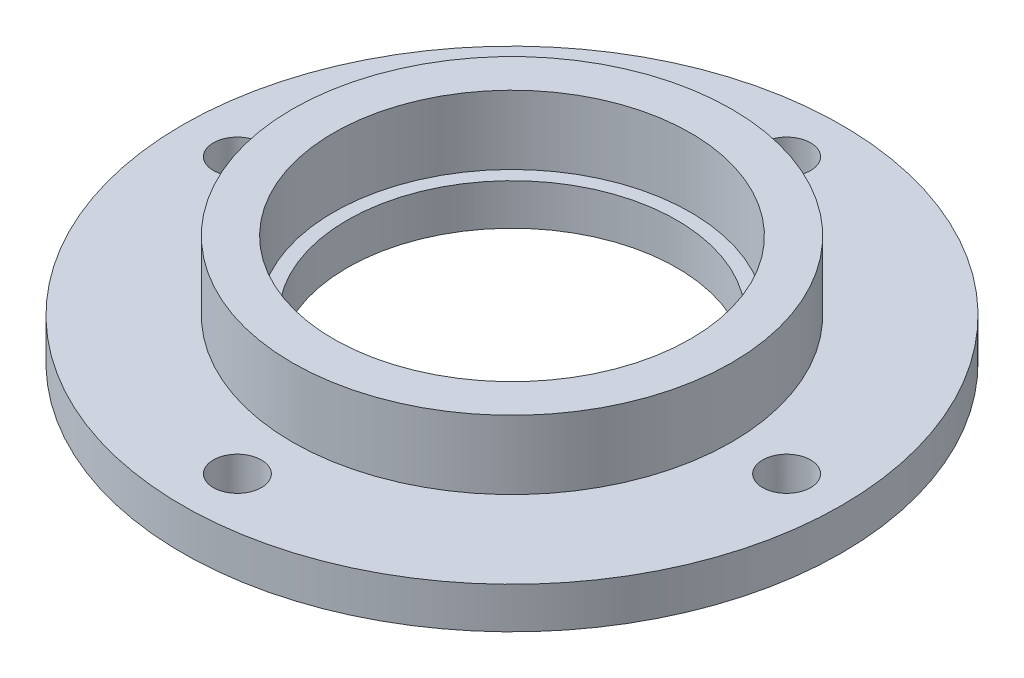
ISO-10303-21;
HEADER;
FILE_DESCRIPTION(('STEP AP214'),'2;1');
FILE_NAME('part.step','',(''),(''),'','','');
FILE_SCHEMA(('AUTOMOTIVE_DESIGN { 1 0 10303 214 1 1 1 1 }'));
ENDSEC;
DATA;
#1=APPLICATION_CONTEXT('core data for automotive mechanical design processes');
#2=APPLICATION_PROTOCOL_DEFINITION('international standard','automotive_design',2000,#1);
#3=PRODUCT_CONTEXT('',#1,'mechanical');
#4=PRODUCT('Part','Part','',(#3));
#5=PRODUCT_RELATED_PRODUCT_CATEGORY('part','',(#4));
#6=PRODUCT_DEFINITION_FORMATION('','',#4);
#7=PRODUCT_DEFINITION_CONTEXT('part definition',#1,'design');
#8=PRODUCT_DEFINITION('design','',#6,#7);
#9=PRODUCT_DEFINITION_SHAPE('','',#8);
#10=(LENGTH_UNIT() NAMED_UNIT(*) SI_UNIT(.MILLI.,.METRE.));
#11=(NAMED_UNIT(*) PLANE_ANGLE_UNIT() SI_UNIT($,.RADIAN.));
#12=(NAMED_UNIT(*) SI_UNIT($,.STERADIAN.) SOLID_ANGLE_UNIT());
#13=UNCERTAINTY_MEASURE_WITH_UNIT(LENGTH_MEASURE(1.E-05),#10,'distance_accuracy_value','');
#14=(GEOMETRIC_REPRESENTATION_CONTEXT(3) GLOBAL_UNCERTAINTY_ASSIGNED_CONTEXT((#13)) GLOBAL_UNIT_ASSIGNED_CONTEXT((#10,
#11,#12)) REPRESENTATION_CONTEXT('',''));
#15=CARTESIAN_POINT('',(0.,0.,0.));
#16=DIRECTION('',(0.,0.,1.));
#17=DIRECTION('',(1.,0.,0.));
#18=AXIS2_PLACEMENT_3D('',#15,#16,#17);
#19=CARTESIAN_POINT('',(9.30660225430559E-13,-271.309816206596,0.));
#20=DIRECTION('',(0.,-1.,0.));
#21=DIRECTION('',(1.,0.,0.));
#22=AXIS2_PLACEMENT_3D('',#19,#20,#21);
#23=CYLINDRICAL_SURFACE('',#22,12.);
#24=CARTESIAN_POINT('',(0.,3.00000000000006,0.));
#25=DIRECTION('',(0.,-1.,0.));
#26=DIRECTION('',(1.,0.,0.));
#27=AXIS2_PLACEMENT_3D('',#24,#25,#26);
#28=CIRCLE('',#27,12.);
#29=CARTESIAN_POINT('',(12.,3.0000000000001,0.));
#30=VERTEX_POINT('',#29);
#31=EDGE_CURVE('E66',#30,#30,#28,.T.);
#32=ORIENTED_EDGE('',*,*,#31,.F.);
#33=EDGE_LOOP('',(#32));
#34=FACE_BOUND('',#33,.T.);
#35=CARTESIAN_POINT('',(0.,0.,0.));
#36=DIRECTION('',(0.,-1.,0.));
#37=DIRECTION('',(1.,0.,0.));
#38=AXIS2_PLACEMENT_3D('',#35,#36,#37);
#39=CIRCLE('',#38,12.);
#40=CARTESIAN_POINT('',(12.,0.,0.));
#41=VERTEX_POINT('',#40);
#42=EDGE_CURVE('E10',#41,#41,#39,.T.);
#43=ORIENTED_EDGE('',*,*,#42,.T.);
#44=EDGE_LOOP('',(#43));
#45=FACE_BOUND('',#44,.T.);
#46=ADVANCED_FACE('F39',(#34,#45),#23,.F.);
#47=CARTESIAN_POINT('',(-12.,0.,0.));
#48=DIRECTION('',(0.,1.,0.));
#49=DIRECTION('',(-1.,0.,0.));
#50=AXIS2_PLACEMENT_3D('',#47,#48,#49);
#51=PLANE('',#50);
#52=CARTESIAN_POINT('',(0.,0.,-20.));
#53=DIRECTION('',(0.,1.,0.));
#54=DIRECTION('',(-1.,0.,0.));
#55=AXIS2_PLACEMENT_3D('',#52,#53,#54);
#56=CIRCLE('',#55,1.75);
#57=CARTESIAN_POINT('',(-1.75,0.,-20.));
#58=VERTEX_POINT('',#57);
#59=EDGE_CURVE('E59',#58,#58,#56,.T.);
#60=ORIENTED_EDGE('',*,*,#59,.T.);
#61=EDGE_LOOP('',(#60));
#62=FACE_BOUND('',#61,.T.);
#63=CARTESIAN_POINT('',(20.,0.,0.));
#64=DIRECTION('',(0.,1.,0.));
#65=DIRECTION('',(-1.,0.,0.));
#66=AXIS2_PLACEMENT_3D('',#63,#64,#65);
#67=CIRCLE('',#66,1.75);
#68=CARTESIAN_POINT('',(18.25,0.,0.));
#69=VERTEX_POINT('',#68);
#70=EDGE_CURVE('E145',#69,#69,#67,.T.);
#71=ORIENTED_EDGE('',*,*,#70,.T.);
#72=EDGE_LOOP('',(#71));
#73=FACE_BOUND('',#72,.T.);
#74=CARTESIAN_POINT('',(-1.39659253553725E-13,0.,20.));
#75=DIRECTION('',(0.,1.,0.));
#76=DIRECTION('',(-1.,0.,0.));
#77=AXIS2_PLACEMENT_3D('',#74,#75,#76);
#78=CIRCLE('',#77,1.75);
#79=CARTESIAN_POINT('',(-1.75000000000014,0.,20.));
#80=VERTEX_POINT('',#79);
#81=EDGE_CURVE('E149',#80,#80,#78,.T.);
#82=ORIENTED_EDGE('',*,*,#81,.T.);
#83=EDGE_LOOP('',(#82));
#84=FACE_BOUND('',#83,.T.);
#85=CARTESIAN_POINT('',(-20.,0.,-2.09488880330588E-13));
#86=DIRECTION('',(0.,1.,0.));
#87=DIRECTION('',(-1.,0.,0.));
#88=AXIS2_PLACEMENT_3D('',#85,#86,#87);
#89=CIRCLE('',#88,1.75);
#90=CARTESIAN_POINT('',(-21.75,0.,-2.09488880330588E-13));
#91=VERTEX_POINT('',#90);
#92=EDGE_CURVE('E78',#91,#91,#89,.T.);
#93=ORIENTED_EDGE('',*,*,#92,.T.);
#94=EDGE_LOOP('',(#93));
#95=FACE_BOUND('',#94,.T.);
#96=ORIENTED_EDGE('',*,*,#42,.F.);
#97=EDGE_LOOP('',(#96));
#98=FACE_BOUND('',#97,.T.);
#99=CARTESIAN_POINT('',(0.,0.,0.));
#100=DIRECTION('',(0.,-1.,0.));
#101=DIRECTION('',(1.,0.,0.));
#102=AXIS2_PLACEMENT_3D('',#99,#100,#101);
#103=CIRCLE('',#102,24.);
#104=CARTESIAN_POINT('',(24.,1.37837127204516E-13,0.));
#105=VERTEX_POINT('',#104);
#106=EDGE_CURVE('E46',#105,#105,#103,.T.);
#107=ORIENTED_EDGE('',*,*,#106,.T.);
#108=EDGE_LOOP('',(#107));
#109=FACE_BOUND('',#108,.T.);
#110=ADVANCED_FACE('F128',(#62,#73,#84,#95,#98,#109),#51,.F.);
#111=CARTESIAN_POINT('',(9.30660225430559E-13,-271.309816206596,0.));
#112=DIRECTION('',(0.,-1.,0.));
#113=DIRECTION('',(1.,0.,0.));
#114=AXIS2_PLACEMENT_3D('',#111,#112,#113);
#115=CYLINDRICAL_SURFACE('',#114,24.);
#116=ORIENTED_EDGE('',*,*,#106,.F.);
#117=EDGE_LOOP('',(#116));
#118=FACE_BOUND('',#117,.T.);
#119=CARTESIAN_POINT('',(0.,3.00000000000006,0.));
#120=DIRECTION('',(0.,-1.,0.));
#121=DIRECTION('',(1.,0.,0.));
#122=AXIS2_PLACEMENT_3D('',#119,#120,#121);
#123=CIRCLE('',#122,24.);
#124=CARTESIAN_POINT('',(23.9999999999999,3.00000000000014,0.));
#125=VERTEX_POINT('',#124);
#126=EDGE_CURVE('E51',#125,#125,#123,.T.);
#127=ORIENTED_EDGE('',*,*,#126,.T.);
#128=EDGE_LOOP('',(#127));
#129=FACE_BOUND('',#128,.T.);
#130=ADVANCED_FACE('F91',(#118,#129),#115,.T.);
#131=CARTESIAN_POINT('',(-24.,2.99999999999998,0.));
#132=DIRECTION('',(0.,-1.,0.));
#133=DIRECTION('',(1.,0.,0.));
#134=AXIS2_PLACEMENT_3D('',#131,#132,#133);
#135=PLANE('',#134);
#136=CARTESIAN_POINT('',(0.,3.00000000000007,-20.));
#137=DIRECTION('',(0.,-1.,0.));
#138=DIRECTION('',(1.,0.,0.));
#139=AXIS2_PLACEMENT_3D('',#136,#137,#138);
#140=CIRCLE('',#139,1.75);
#141=CARTESIAN_POINT('',(1.74999999999999,3.00000000000007,-20.));
#142=VERTEX_POINT('',#141);
#143=EDGE_CURVE('E42',#142,#142,#140,.T.);
#144=ORIENTED_EDGE('',*,*,#143,.T.);
#145=EDGE_LOOP('',(#144));
#146=FACE_BOUND('',#145,.T.);
#147=CARTESIAN_POINT('',(20.,3.00000000000013,0.));
#148=DIRECTION('',(0.,-1.,0.));
#149=DIRECTION('',(1.,0.,0.));
#150=AXIS2_PLACEMENT_3D('',#147,#148,#149);
#151=CIRCLE('',#150,1.75);
#152=CARTESIAN_POINT('',(21.75,3.00000000000014,0.));
#153=VERTEX_POINT('',#152);
#154=EDGE_CURVE('E61',#153,#153,#151,.T.);
#155=ORIENTED_EDGE('',*,*,#154,.T.);
#156=EDGE_LOOP('',(#155));
#157=FACE_BOUND('',#156,.T.);
#158=CARTESIAN_POINT('',(-1.49950000550383E-13,3.00000000000007,20.));
#159=DIRECTION('',(0.,-1.,0.));
#160=DIRECTION('',(1.,0.,0.));
#161=AXIS2_PLACEMENT_3D('',#158,#159,#160);
#162=CIRCLE('',#161,1.75);
#163=CARTESIAN_POINT('',(1.74999999999985,3.00000000000007,20.));
#164=VERTEX_POINT('',#163);
#165=EDGE_CURVE('E58',#164,#164,#162,.T.);
#166=ORIENTED_EDGE('',*,*,#165,.T.);
#167=EDGE_LOOP('',(#166));
#168=FACE_BOUND('',#167,.T.);
#169=CARTESIAN_POINT('',(-20.,3.,-2.09488880330588E-13));
#170=DIRECTION('',(0.,-1.,0.));
#171=DIRECTION('',(1.,0.,0.));
#172=AXIS2_PLACEMENT_3D('',#169,#170,#171);
#173=CIRCLE('',#172,1.75);
#174=CARTESIAN_POINT('',(-18.25,3.,-2.09488880330588E-13));
#175=VERTEX_POINT('',#174);
#176=EDGE_CURVE('E55',#175,#175,#173,.T.);
#177=ORIENTED_EDGE('',*,*,#176,.T.);
#178=EDGE_LOOP('',(#177));
#179=FACE_BOUND('',#178,.T.);
#180=ORIENTED_EDGE('',*,*,#126,.F.);
#181=EDGE_LOOP('',(#180));
#182=FACE_BOUND('',#181,.T.);
#183=CARTESIAN_POINT('',(0.,3.00000000000006,0.));
#184=DIRECTION('',(0.,-1.,0.));
#185=DIRECTION('',(1.,0.,0.));
#186=AXIS2_PLACEMENT_3D('',#183,#184,#185);
#187=CIRCLE('',#186,16.);
#188=CARTESIAN_POINT('',(16.,3.00000000000011,0.));
#189=VERTEX_POINT('',#188);
#190=EDGE_CURVE('E86',#189,#189,#187,.T.);
#191=ORIENTED_EDGE('',*,*,#190,.T.);
#192=EDGE_LOOP('',(#191));
#193=FACE_BOUND('',#192,.T.);
#194=ADVANCED_FACE('F93',(#146,#157,#168,#179,#182,#193),#135,.F.);
#195=CARTESIAN_POINT('',(9.30660225430559E-13,-271.309816206596,0.));
#196=DIRECTION('',(0.,-1.,0.));
#197=DIRECTION('',(1.,0.,0.));
#198=AXIS2_PLACEMENT_3D('',#195,#196,#197);
#199=CYLINDRICAL_SURFACE('',#198,16.);
#200=ORIENTED_EDGE('',*,*,#190,.F.);
#201=EDGE_LOOP('',(#200));
#202=FACE_BOUND('',#201,.T.);
#203=CARTESIAN_POINT('',(0.,8.00000000000006,0.));
#204=DIRECTION('',(0.,-1.,0.));
#205=DIRECTION('',(1.,0.,0.));
#206=AXIS2_PLACEMENT_3D('',#203,#204,#205);
#207=CIRCLE('',#206,16.);
#208=CARTESIAN_POINT('',(15.9999999999999,8.00000000000012,0.));
#209=VERTEX_POINT('',#208);
#210=EDGE_CURVE('E83',#209,#209,#207,.T.);
#211=ORIENTED_EDGE('',*,*,#210,.T.);
#212=EDGE_LOOP('',(#211));
#213=FACE_BOUND('',#212,.T.);
#214=ADVANCED_FACE('F96',(#202,#213),#199,.T.);
#215=CARTESIAN_POINT('',(-16.,7.99999999999999,0.));
#216=DIRECTION('',(0.,-1.,0.));
#217=DIRECTION('',(1.,0.,0.));
#218=AXIS2_PLACEMENT_3D('',#215,#216,#217);
#219=PLANE('',#218);
#220=ORIENTED_EDGE('',*,*,#210,.F.);
#221=EDGE_LOOP('',(#220));
#222=FACE_BOUND('',#221,.T.);
#223=CARTESIAN_POINT('',(0.,8.00000000000006,0.));
#224=DIRECTION('',(0.,-1.,0.));
#225=DIRECTION('',(1.,0.,0.));
#226=AXIS2_PLACEMENT_3D('',#223,#224,#225);
#227=CIRCLE('',#226,13.);
#228=CARTESIAN_POINT('',(12.9999999999999,8.00000000000011,0.));
#229=VERTEX_POINT('',#228);
#230=EDGE_CURVE('E75',#229,#229,#227,.T.);
#231=ORIENTED_EDGE('',*,*,#230,.T.);
#232=EDGE_LOOP('',(#231));
#233=FACE_BOUND('',#232,.T.);
#234=ADVANCED_FACE('F102',(#222,#233),#219,.F.);
#235=CARTESIAN_POINT('',(9.30660225430559E-13,-271.309816206596,0.));
#236=DIRECTION('',(0.,-1.,0.));
#237=DIRECTION('',(1.,0.,0.));
#238=AXIS2_PLACEMENT_3D('',#235,#236,#237);
#239=CYLINDRICAL_SURFACE('',#238,13.);
#240=ORIENTED_EDGE('',*,*,#230,.F.);
#241=EDGE_LOOP('',(#240));
#242=FACE_BOUND('',#241,.T.);
#243=CARTESIAN_POINT('',(0.,3.00000000000006,0.));
#244=DIRECTION('',(0.,-1.,0.));
#245=DIRECTION('',(1.,0.,0.));
#246=AXIS2_PLACEMENT_3D('',#243,#244,#245);
#247=CIRCLE('',#246,13.);
#248=CARTESIAN_POINT('',(13.,3.0000000000001,0.));
#249=VERTEX_POINT('',#248);
#250=EDGE_CURVE('E70',#249,#249,#247,.T.);
#251=ORIENTED_EDGE('',*,*,#250,.T.);
#252=EDGE_LOOP('',(#251));
#253=FACE_BOUND('',#252,.T.);
#254=ADVANCED_FACE('F108',(#242,#253),#239,.F.);
#255=CARTESIAN_POINT('',(-13.,3.,0.));
#256=DIRECTION('',(0.,-1.,0.));
#257=DIRECTION('',(1.,0.,0.));
#258=AXIS2_PLACEMENT_3D('',#255,#256,#257);
#259=PLANE('',#258);
#260=ORIENTED_EDGE('',*,*,#250,.F.);
#261=EDGE_LOOP('',(#260));
#262=FACE_BOUND('',#261,.T.);
#263=ORIENTED_EDGE('',*,*,#31,.T.);
#264=EDGE_LOOP('',(#263));
#265=FACE_BOUND('',#264,.T.);
#266=ADVANCED_FACE('F114',(#262,#265),#259,.F.);
#267=CARTESIAN_POINT('',(-20.,0.,-2.09488880330588E-13));
#268=DIRECTION('',(0.,1.,0.));
#269=DIRECTION('',(-1.,0.,0.));
#270=AXIS2_PLACEMENT_3D('',#267,#268,#269);
#271=CYLINDRICAL_SURFACE('',#270,1.75);
#272=ORIENTED_EDGE('',*,*,#92,.F.);
#273=EDGE_LOOP('',(#272));
#274=FACE_BOUND('',#273,.T.);
#275=ORIENTED_EDGE('',*,*,#176,.F.);
#276=EDGE_LOOP('',(#275));
#277=FACE_BOUND('',#276,.T.);
#278=ADVANCED_FACE('F119',(#274,#277),#271,.F.);
#279=CARTESIAN_POINT('',(-1.39659253553725E-13,0.,20.));
#280=DIRECTION('',(0.,1.,0.));
#281=DIRECTION('',(-1.,0.,0.));
#282=AXIS2_PLACEMENT_3D('',#279,#280,#281);
#283=CYLINDRICAL_SURFACE('',#282,1.75);
#284=ORIENTED_EDGE('',*,*,#81,.F.);
#285=EDGE_LOOP('',(#284));
#286=FACE_BOUND('',#285,.T.);
#287=ORIENTED_EDGE('',*,*,#165,.F.);
#288=EDGE_LOOP('',(#287));
#289=FACE_BOUND('',#288,.T.);
#290=ADVANCED_FACE('F124',(#286,#289),#283,.F.);
#291=CARTESIAN_POINT('',(20.,0.,0.));
#292=DIRECTION('',(0.,1.,0.));
#293=DIRECTION('',(-1.,0.,0.));
#294=AXIS2_PLACEMENT_3D('',#291,#292,#293);
#295=CYLINDRICAL_SURFACE('',#294,1.75);
#296=ORIENTED_EDGE('',*,*,#70,.F.);
#297=EDGE_LOOP('',(#296));
#298=FACE_BOUND('',#297,.T.);
#299=ORIENTED_EDGE('',*,*,#154,.F.);
#300=EDGE_LOOP('',(#299));
#301=FACE_BOUND('',#300,.T.);
#302=ADVANCED_FACE('F163',(#298,#301),#295,.F.);
#303=CARTESIAN_POINT('',(0.,0.,-20.));
#304=DIRECTION('',(0.,1.,0.));
#305=DIRECTION('',(-1.,0.,0.));
#306=AXIS2_PLACEMENT_3D('',#303,#304,#305);
#307=CYLINDRICAL_SURFACE('',#306,1.75);
#308=ORIENTED_EDGE('',*,*,#59,.F.);
#309=EDGE_LOOP('',(#308));
#310=FACE_BOUND('',#309,.T.);
#311=ORIENTED_EDGE('',*,*,#143,.F.);
#312=EDGE_LOOP('',(#311));
#313=FACE_BOUND('',#312,.T.);
#314=ADVANCED_FACE('F170',(#310,#313),#307,.F.);
#315=CLOSED_SHELL('',(#46,#110,#130,#194,#214,#234,#254,#266,#278,#290,#302,#314));
#316=MANIFOLD_SOLID_BREP('B2',#315);
#317=ADVANCED_BREP_SHAPE_REPRESENTATION('',(#18,#316),#14);
#318=SHAPE_DEFINITION_REPRESENTATION(#9,#317);
ENDSEC;
END-ISO-10303-21;
